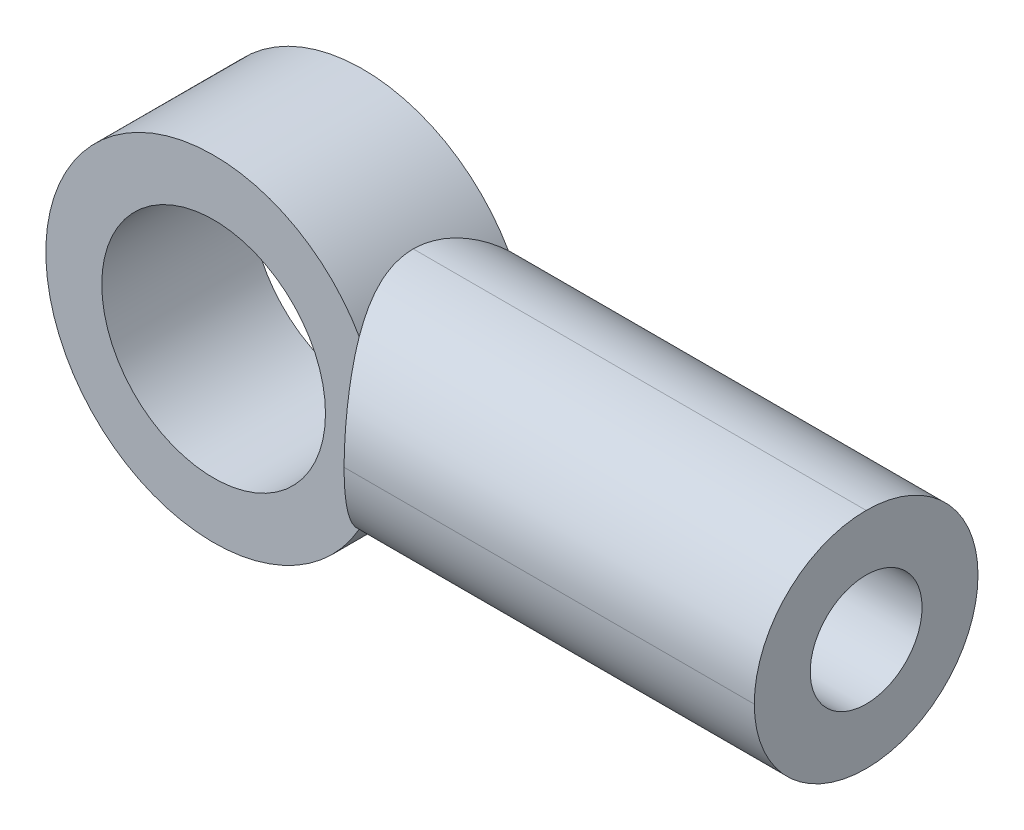
ISO-10303-21;
HEADER;
FILE_DESCRIPTION(('STEP AP214'),'2;1');
FILE_NAME('part.step','',(''),(''),'','','');
FILE_SCHEMA(('AUTOMOTIVE_DESIGN { 1 0 10303 214 1 1 1 1 }'));
ENDSEC;
DATA;
#1=APPLICATION_CONTEXT('core data for automotive mechanical design processes');
#2=APPLICATION_PROTOCOL_DEFINITION('international standard','automotive_design',2000,#1);
#3=PRODUCT_CONTEXT('',#1,'mechanical');
#4=PRODUCT('Part','Part','',(#3));
#5=PRODUCT_RELATED_PRODUCT_CATEGORY('part','',(#4));
#6=PRODUCT_DEFINITION_FORMATION('','',#4);
#7=PRODUCT_DEFINITION_CONTEXT('part definition',#1,'design');
#8=PRODUCT_DEFINITION('design','',#6,#7);
#9=PRODUCT_DEFINITION_SHAPE('','',#8);
#10=(LENGTH_UNIT() NAMED_UNIT(*) SI_UNIT(.MILLI.,.METRE.));
#11=(NAMED_UNIT(*) PLANE_ANGLE_UNIT() SI_UNIT($,.RADIAN.));
#12=(NAMED_UNIT(*) SI_UNIT($,.STERADIAN.) SOLID_ANGLE_UNIT());
#13=UNCERTAINTY_MEASURE_WITH_UNIT(LENGTH_MEASURE(1.E-05),#10,'distance_accuracy_value','');
#14=(GEOMETRIC_REPRESENTATION_CONTEXT(3) GLOBAL_UNCERTAINTY_ASSIGNED_CONTEXT((#13)) GLOBAL_UNIT_ASSIGNED_CONTEXT((#10,
#11,#12)) REPRESENTATION_CONTEXT('',''));
#15=CARTESIAN_POINT('',(0.,0.,0.));
#16=DIRECTION('',(0.,0.,1.));
#17=DIRECTION('',(1.,0.,0.));
#18=AXIS2_PLACEMENT_3D('',#15,#16,#17);
#19=CARTESIAN_POINT('',(0.,0.,3.));
#20=DIRECTION('',(0.,0.,-1.));
#21=DIRECTION('',(-1.,0.,0.));
#22=AXIS2_PLACEMENT_3D('',#19,#20,#21);
#23=CYLINDRICAL_SURFACE('',#22,4.5);
#24=CARTESIAN_POINT('',(3.35410196624968,-3.,0.));
#25=CARTESIAN_POINT('',(3.35406134429177,-3.00001922649583,0.0737500729630075));
#26=CARTESIAN_POINT('',(3.3565333263811,-2.99728132847849,0.147474878822638));
#27=CARTESIAN_POINT('',(3.36618995948174,-2.98644589716527,0.294122881992987));
#28=CARTESIAN_POINT('',(3.37336829420329,-2.97835554714265,0.367047020678862));
#29=CARTESIAN_POINT('',(3.39203341996339,-2.95707534928772,0.51082564887276));
#30=CARTESIAN_POINT('',(3.40347668413969,-2.9439369798464,0.581693504350629));
#31=CARTESIAN_POINT('',(3.43016257931678,-2.91280054555006,0.721619797131198));
#32=CARTESIAN_POINT('',(3.44540631506336,-2.89480106750951,0.790677701843711));
#33=CARTESIAN_POINT('',(3.49579219705687,-2.8341116995379,0.993826292014371));
#34=CARTESIAN_POINT('',(3.5357133177395,-2.78459837578925,1.12475489564761));
#35=CARTESIAN_POINT('',(3.62363577254264,-2.66918201900051,1.37650076811295));
#36=CARTESIAN_POINT('',(3.67166009211261,-2.60323210082252,1.49728776726599));
#37=CARTESIAN_POINT('',(3.77920279642146,-2.44501748892159,1.74549101590243));
#38=CARTESIAN_POINT('',(3.83935114384056,-2.35026226206031,1.87105269878833));
#39=CARTESIAN_POINT('',(3.95919561404939,-2.14225023379348,2.10604819572586));
#40=CARTESIAN_POINT('',(4.01889146507348,-2.02898311335466,2.21547294952505));
#41=CARTESIAN_POINT('',(4.14139365529746,-1.76708092389747,2.43107414050749));
#42=CARTESIAN_POINT('',(4.20338729938338,-1.61569746061092,2.53445771988131));
#43=CARTESIAN_POINT('',(4.2859943906525,-1.3738802693201,2.66851230850701));
#44=CARTESIAN_POINT('',(4.31178850797788,-1.29086583935502,2.7096773120417));
#45=CARTESIAN_POINT('',(4.35918703932191,-1.1203958838131,2.78448476521184));
#46=CARTESIAN_POINT('',(4.38079470051315,-1.03294386717625,2.81813304822261));
#47=CARTESIAN_POINT('',(4.41596043448945,-0.868981795511263,2.87246582221212));
#48=CARTESIAN_POINT('',(4.43025761885054,-0.793031936319327,2.89437164890672));
#49=CARTESIAN_POINT('',(4.45507284097399,-0.639065344131672,2.9322137473963));
#50=CARTESIAN_POINT('',(4.46559189616575,-0.561049173667882,2.94815162637604));
#51=CARTESIAN_POINT('',(4.48263156751613,-0.402951343028388,2.97390065684391));
#52=CARTESIAN_POINT('',(4.48912069393415,-0.322858387972111,2.9836635679772));
#53=CARTESIAN_POINT('',(4.49781756203709,-0.161848615283422,2.99672598304132));
#54=CARTESIAN_POINT('',(4.50002158690586,-0.0809311435706957,3.00001987589298));
#55=CARTESIAN_POINT('',(4.5,0.,3.));
#56=B_SPLINE_CURVE_WITH_KNOTS('',3,(#24,#25,#26,#27,#28,#29,#30,#31,#32,#33,#34,#35,#36,#37,#38,
#39,#40,#41,#42,#43,#44,#45,#46,#47,#48,#49,#50,#51,#52,#53,#54,#55),.UNSPECIFIED.,.F.,.F.,(4,2,
2,2,2,2,2,2,2,2,2,2,2,2,2,4),(0.,0.221117290150849,0.441938429564277,0.660565025502978,
0.879255247491347,1.3140236854943,1.75004677971232,2.25337247445359,2.75697969960203,
3.33391454856022,3.62207411220942,3.9100092657634,4.15068140679281,4.39128868745874,
4.63375315982037,4.87642784762445),.UNSPECIFIED.);
#57=CARTESIAN_POINT('',(3.35410196624968,-3.,0.));
#58=VERTEX_POINT('',#57);
#59=CARTESIAN_POINT('',(3.90512483795333,-2.23606797749979,2.));
#60=VERTEX_POINT('',#59);
#61=EDGE_CURVE('E100',#58,#60,#56,.T.);
#62=ORIENTED_EDGE('',*,*,#61,.T.);
#63=CARTESIAN_POINT('',(0.,0.,2.));
#64=DIRECTION('',(0.,0.,1.));
#65=DIRECTION('',(1.,0.,0.));
#66=AXIS2_PLACEMENT_3D('',#63,#64,#65);
#67=CIRCLE('',#66,4.5);
#68=CARTESIAN_POINT('',(3.90512483795333,2.23606797749979,2.));
#69=VERTEX_POINT('',#68);
#70=EDGE_CURVE('E50',#69,#60,#67,.T.);
#71=ORIENTED_EDGE('',*,*,#70,.F.);
#72=CARTESIAN_POINT('',(4.5,0.,3.));
#73=CARTESIAN_POINT('',(4.50001617829843,0.0756475839526088,3.00001479337604));
#74=CARTESIAN_POINT('',(4.49809296179134,0.15128401615669,2.99713920958104));
#75=CARTESIAN_POINT('',(4.49049022821725,0.301896170959764,2.98572195766942));
#76=CARTESIAN_POINT('',(4.48481284482209,0.376872244359036,2.97718350802096));
#77=CARTESIAN_POINT('',(4.46986964389088,0.525159703140233,2.95462384888522));
#78=CARTESIAN_POINT('',(4.46062588677823,0.598478444991007,2.94063634042276));
#79=CARTESIAN_POINT('',(4.43877875645743,0.743384811046702,2.90738922412249));
#80=CARTESIAN_POINT('',(4.42617506145128,0.814972268721229,2.88812911129631));
#81=CARTESIAN_POINT('',(4.38378192752443,1.02614451296516,2.82288077442639));
#82=CARTESIAN_POINT('',(4.34936538300913,1.16256292939198,2.76935834052541));
#83=CARTESIAN_POINT('',(4.27094017557267,1.42400473597409,2.64448206211332));
#84=CARTESIAN_POINT('',(4.22691920643969,1.54901321232293,2.5731053234158));
#85=CARTESIAN_POINT('',(4.12840642155255,1.79593011791963,2.40800877182395));
#86=CARTESIAN_POINT('',(4.07334466925175,1.91668821691472,2.31291240952251));
#87=CARTESIAN_POINT('',(3.95972492705014,2.14161105109933,2.10638698624117));
#88=CARTESIAN_POINT('',(3.90116254660953,2.24575432087847,1.99493714850863));
#89=CARTESIAN_POINT('',(3.77593429371759,2.45131731165124,1.73843958633942));
#90=CARTESIAN_POINT('',(3.70944663388175,2.54971849148677,1.59086511289124));
#91=CARTESIAN_POINT('',(3.58627882725789,2.72023311787638,1.27751600863165));
#92=CARTESIAN_POINT('',(3.52958469468627,2.79238421697602,1.11176789367188));
#93=CARTESIAN_POINT('',(3.44937197620885,2.89044625252346,0.813888743130085));
#94=CARTESIAN_POINT('',(3.42100530248184,2.92366456859799,0.685517816812848));
#95=CARTESIAN_POINT('',(3.38895349570405,2.96061579891419,0.489078166455413));
#96=CARTESIAN_POINT('',(3.38002314600923,2.9707828945105,0.423022405469136));
#97=CARTESIAN_POINT('',(3.3659677668099,2.98670034948591,0.289994712459127));
#98=CARTESIAN_POINT('',(3.36084030684112,2.99245352992276,0.223023393502944));
#99=CARTESIAN_POINT('',(3.35651675795855,2.99729829619032,0.129921847014653));
#100=CARTESIAN_POINT('',(3.35561173290739,2.99831129239719,0.103951023260638));
#101=CARTESIAN_POINT('',(3.35440443622911,2.99966195084455,0.0519879839956209));
#102=CARTESIAN_POINT('',(3.35410192949018,2.99999987650801,0.0259957807897194));
#103=CARTESIAN_POINT('',(3.35410196625091,3.00000000000001,0.));
#104=B_SPLINE_CURVE_WITH_KNOTS('',3,(#72,#73,#74,#75,#76,#77,#78,#79,#80,#81,#82,#83,#84,#85,
#86,#87,#88,#89,#90,#91,#92,#93,#94,#95,#96,#97,#98,#99,#100,#101,#102,#103),.UNSPECIFIED.,.F.,
.F.,(4,2,2,2,2,2,2,2,2,2,2,2,2,2,2,4),(0.,0.226845375414056,0.453561934483315,0.678898019294547,
0.904255693424228,1.35369386011239,1.80371131263528,2.29167686469777,2.78026782257844,
3.34589677629489,3.91071117528374,4.31569115064711,4.51775757505383,4.71969474527131,
4.79770147059075,4.87567775052966),.UNSPECIFIED.);
#105=CARTESIAN_POINT('',(3.35410196624968,3.,0.));
#106=VERTEX_POINT('',#105);
#107=EDGE_CURVE('E43',#69,#106,#104,.T.);
#108=ORIENTED_EDGE('',*,*,#107,.T.);
#109=CARTESIAN_POINT('',(3.35410196624968,3.,0.));
#110=CARTESIAN_POINT('',(3.35406134429177,3.00001922649583,-0.0737500729630075));
#111=CARTESIAN_POINT('',(3.3565333263811,2.99728132847849,-0.147474878822638));
#112=CARTESIAN_POINT('',(3.36618995948174,2.98644589716527,-0.294122881992987));
#113=CARTESIAN_POINT('',(3.37336829420329,2.97835554714265,-0.367047020678862));
#114=CARTESIAN_POINT('',(3.39203341996339,2.95707534928772,-0.51082564887276));
#115=CARTESIAN_POINT('',(3.40347668413969,2.9439369798464,-0.581693504350629));
#116=CARTESIAN_POINT('',(3.43016257931678,2.91280054555006,-0.721619797131198));
#117=CARTESIAN_POINT('',(3.44540631506336,2.89480106750951,-0.790677701843711));
#118=CARTESIAN_POINT('',(3.49579219705687,2.8341116995379,-0.993826292014371));
#119=CARTESIAN_POINT('',(3.5357133177395,2.78459837578925,-1.12475489564761));
#120=CARTESIAN_POINT('',(3.62363577254264,2.66918201900051,-1.37650076811295));
#121=CARTESIAN_POINT('',(3.67166009211261,2.60323210082252,-1.49728776726599));
#122=CARTESIAN_POINT('',(3.77920279642146,2.44501748892159,-1.74549101590243));
#123=CARTESIAN_POINT('',(3.83935114384056,2.35026226206031,-1.87105269878833));
#124=CARTESIAN_POINT('',(3.95919561404939,2.14225023379348,-2.10604819572586));
#125=CARTESIAN_POINT('',(4.01889146507348,2.02898311335466,-2.21547294952505));
#126=CARTESIAN_POINT('',(4.14139365529746,1.76708092389747,-2.43107414050749));
#127=CARTESIAN_POINT('',(4.20338729938338,1.61569746061092,-2.53445771988131));
#128=CARTESIAN_POINT('',(4.2859943906525,1.3738802693201,-2.66851230850701));
#129=CARTESIAN_POINT('',(4.31178850797788,1.29086583935502,-2.7096773120417));
#130=CARTESIAN_POINT('',(4.35918703932191,1.1203958838131,-2.78448476521184));
#131=CARTESIAN_POINT('',(4.38079470051315,1.03294386717625,-2.81813304822261));
#132=CARTESIAN_POINT('',(4.41596043448945,0.868981795511263,-2.87246582221212));
#133=CARTESIAN_POINT('',(4.43025761885054,0.793031936319327,-2.89437164890672));
#134=CARTESIAN_POINT('',(4.45507284097399,0.639065344131672,-2.9322137473963));
#135=CARTESIAN_POINT('',(4.46559189616575,0.561049173667882,-2.94815162637604));
#136=CARTESIAN_POINT('',(4.48263156751613,0.402951343028388,-2.97390065684391));
#137=CARTESIAN_POINT('',(4.48912069393415,0.322858387972111,-2.9836635679772));
#138=CARTESIAN_POINT('',(4.49781756203709,0.161848615283422,-2.99672598304132));
#139=CARTESIAN_POINT('',(4.50002158690586,0.0809311435706957,-3.00001987589298));
#140=CARTESIAN_POINT('',(4.5,0.,-3.));
#141=B_SPLINE_CURVE_WITH_KNOTS('',3,(#109,#110,#111,#112,#113,#114,#115,#116,#117,#118,#119,
#120,#121,#122,#123,#124,#125,#126,#127,#128,#129,#130,#131,#132,#133,#134,#135,#136,#137,#138,
#139,#140),.UNSPECIFIED.,.F.,.F.,(4,2,2,2,2,2,2,2,2,2,2,2,2,2,2,4),(0.,0.221117290150849,
0.441938429564277,0.660565025502978,0.879255247491347,1.3140236854943,1.75004677971232,
2.25337247445359,2.75697969960203,3.33391454856022,3.62207411220942,3.9100092657634,
4.15068140679281,4.39128868745874,4.63375315982037,4.87642784762445),.UNSPECIFIED.);
#142=CARTESIAN_POINT('',(3.90512483795333,2.23606797749979,-2.));
#143=VERTEX_POINT('',#142);
#144=EDGE_CURVE('E107',#106,#143,#141,.T.);
#145=ORIENTED_EDGE('',*,*,#144,.T.);
#146=CARTESIAN_POINT('',(0.,0.,-2.));
#147=DIRECTION('',(0.,0.,1.));
#148=DIRECTION('',(1.,0.,0.));
#149=AXIS2_PLACEMENT_3D('',#146,#147,#148);
#150=CIRCLE('',#149,4.5);
#151=CARTESIAN_POINT('',(3.90512483795333,-2.23606797749979,-2.));
#152=VERTEX_POINT('',#151);
#153=EDGE_CURVE('E206',#143,#152,#150,.T.);
#154=ORIENTED_EDGE('',*,*,#153,.T.);
#155=CARTESIAN_POINT('',(4.5,0.,-3.));
#156=CARTESIAN_POINT('',(4.50001617829843,-0.0756475839526088,-3.00001479337604));
#157=CARTESIAN_POINT('',(4.49809296179134,-0.15128401615669,-2.99713920958104));
#158=CARTESIAN_POINT('',(4.49049022821725,-0.301896170959764,-2.98572195766942));
#159=CARTESIAN_POINT('',(4.48481284482209,-0.376872244359036,-2.97718350802096));
#160=CARTESIAN_POINT('',(4.46986964389088,-0.525159703140233,-2.95462384888522));
#161=CARTESIAN_POINT('',(4.46062588677823,-0.598478444991007,-2.94063634042276));
#162=CARTESIAN_POINT('',(4.43877875645743,-0.743384811046702,-2.90738922412249));
#163=CARTESIAN_POINT('',(4.42617506145128,-0.814972268721229,-2.88812911129631));
#164=CARTESIAN_POINT('',(4.38378192752443,-1.02614451296516,-2.82288077442639));
#165=CARTESIAN_POINT('',(4.34936538300913,-1.16256292939198,-2.76935834052541));
#166=CARTESIAN_POINT('',(4.27094017557267,-1.42400473597409,-2.64448206211332));
#167=CARTESIAN_POINT('',(4.22691920643969,-1.54901321232293,-2.5731053234158));
#168=CARTESIAN_POINT('',(4.12840642155255,-1.79593011791963,-2.40800877182395));
#169=CARTESIAN_POINT('',(4.07334466925175,-1.91668821691472,-2.31291240952251));
#170=CARTESIAN_POINT('',(3.95972492705014,-2.14161105109933,-2.10638698624117));
#171=CARTESIAN_POINT('',(3.90116254660953,-2.24575432087847,-1.99493714850863));
#172=CARTESIAN_POINT('',(3.77593429371759,-2.45131731165124,-1.73843958633942));
#173=CARTESIAN_POINT('',(3.70944663388175,-2.54971849148677,-1.59086511289124));
#174=CARTESIAN_POINT('',(3.58627882725789,-2.72023311787638,-1.27751600863165));
#175=CARTESIAN_POINT('',(3.52958469468627,-2.79238421697602,-1.11176789367188));
#176=CARTESIAN_POINT('',(3.44937197620885,-2.89044625252346,-0.813888743130085));
#177=CARTESIAN_POINT('',(3.42100530248184,-2.92366456859799,-0.685517816812848));
#178=CARTESIAN_POINT('',(3.38895349570405,-2.96061579891419,-0.489078166455413));
#179=CARTESIAN_POINT('',(3.38002314600923,-2.9707828945105,-0.423022405469136));
#180=CARTESIAN_POINT('',(3.3659677668099,-2.98670034948591,-0.289994712459127));
#181=CARTESIAN_POINT('',(3.36084030684112,-2.99245352992276,-0.223023393502944));
#182=CARTESIAN_POINT('',(3.35651675795855,-2.99729829619032,-0.129921847014653));
#183=CARTESIAN_POINT('',(3.35561173290739,-2.99831129239719,-0.103951023260638));
#184=CARTESIAN_POINT('',(3.35440443622911,-2.99966195084455,-0.0519879839956209));
#185=CARTESIAN_POINT('',(3.35410192949018,-2.99999987650801,-0.0259957807897194));
#186=CARTESIAN_POINT('',(3.35410196625091,-3.00000000000001,0.));
#187=B_SPLINE_CURVE_WITH_KNOTS('',3,(#155,#156,#157,#158,#159,#160,#161,#162,#163,#164,#165,
#166,#167,#168,#169,#170,#171,#172,#173,#174,#175,#176,#177,#178,#179,#180,#181,#182,#183,#184,
#185,#186),.UNSPECIFIED.,.F.,.F.,(4,2,2,2,2,2,2,2,2,2,2,2,2,2,2,4),(0.,0.226845375414056,
0.453561934483315,0.678898019294547,0.904255693424228,1.35369386011239,1.80371131263528,
2.29167686469777,2.78026782257844,3.34589677629489,3.91071117528374,4.31569115064711,
4.51775757505383,4.71969474527131,4.79770147059075,4.87567775052966),.UNSPECIFIED.);
#188=EDGE_CURVE('E137',#152,#58,#187,.T.);
#189=ORIENTED_EDGE('',*,*,#188,.T.);
#190=EDGE_LOOP('',(#62,#71,#108,#145,#154,#189));
#191=FACE_BOUND('',#190,.T.);
#192=ADVANCED_FACE('F33',(#191),#23,.T.);
#193=CARTESIAN_POINT('',(15.5,-3.,3.));
#194=DIRECTION('',(-1.,0.,0.));
#195=DIRECTION('',(0.,0.,1.));
#196=AXIS2_PLACEMENT_3D('',#193,#194,#195);
#197=PLANE('',#196);
#198=CARTESIAN_POINT('',(15.5,0.,0.));
#199=DIRECTION('',(1.,0.,0.));
#200=DIRECTION('',(0.,0.,-1.));
#201=AXIS2_PLACEMENT_3D('',#198,#199,#200);
#202=CIRCLE('',#201,1.5);
#203=CARTESIAN_POINT('',(15.5,0.,-1.5));
#204=VERTEX_POINT('',#203);
#205=EDGE_CURVE('E154',#204,#204,#202,.T.);
#206=ORIENTED_EDGE('',*,*,#205,.F.);
#207=EDGE_LOOP('',(#206));
#208=FACE_BOUND('',#207,.T.);
#209=CARTESIAN_POINT('',(15.5,0.,0.));
#210=DIRECTION('',(-1.,0.,0.));
#211=DIRECTION('',(0.,0.,1.));
#212=AXIS2_PLACEMENT_3D('',#209,#210,#211);
#213=CIRCLE('',#212,3.);
#214=CARTESIAN_POINT('',(15.5,3.,0.));
#215=VERTEX_POINT('',#214);
#216=CARTESIAN_POINT('',(15.5,0.,3.));
#217=VERTEX_POINT('',#216);
#218=EDGE_CURVE('E149',#215,#217,#213,.F.);
#219=ORIENTED_EDGE('',*,*,#218,.T.);
#220=CARTESIAN_POINT('',(15.5,0.,0.));
#221=DIRECTION('',(-1.,0.,0.));
#222=DIRECTION('',(0.,0.,1.));
#223=AXIS2_PLACEMENT_3D('',#220,#221,#222);
#224=CIRCLE('',#223,3.);
#225=CARTESIAN_POINT('',(15.5,-3.,0.));
#226=VERTEX_POINT('',#225);
#227=EDGE_CURVE('E142',#217,#226,#224,.F.);
#228=ORIENTED_EDGE('',*,*,#227,.T.);
#229=CARTESIAN_POINT('',(15.5,0.,0.));
#230=DIRECTION('',(-1.,0.,0.));
#231=DIRECTION('',(0.,0.,1.));
#232=AXIS2_PLACEMENT_3D('',#229,#230,#231);
#233=CIRCLE('',#232,3.);
#234=CARTESIAN_POINT('',(15.5,0.,-3.));
#235=VERTEX_POINT('',#234);
#236=EDGE_CURVE('E145',#226,#235,#233,.F.);
#237=ORIENTED_EDGE('',*,*,#236,.T.);
#238=CARTESIAN_POINT('',(15.5,0.,0.));
#239=DIRECTION('',(-1.,0.,0.));
#240=DIRECTION('',(0.,0.,1.));
#241=AXIS2_PLACEMENT_3D('',#238,#239,#240);
#242=CIRCLE('',#241,3.);
#243=EDGE_CURVE('E147',#235,#215,#242,.F.);
#244=ORIENTED_EDGE('',*,*,#243,.T.);
#245=EDGE_LOOP('',(#219,#228,#237,#244));
#246=FACE_BOUND('',#245,.T.);
#247=ADVANCED_FACE('F183',(#208,#246),#197,.F.);
#248=CARTESIAN_POINT('',(0.,0.,-3.));
#249=DIRECTION('',(0.,0.,1.));
#250=DIRECTION('',(1.,0.,0.));
#251=AXIS2_PLACEMENT_3D('',#248,#249,#250);
#252=CYLINDRICAL_SURFACE('',#251,3.);
#253=CARTESIAN_POINT('',(0.,0.,2.));
#254=DIRECTION('',(0.,0.,-1.));
#255=DIRECTION('',(-1.,0.,0.));
#256=AXIS2_PLACEMENT_3D('',#253,#254,#255);
#257=CIRCLE('',#256,3.);
#258=CARTESIAN_POINT('',(-3.,0.,2.));
#259=VERTEX_POINT('',#258);
#260=EDGE_CURVE('E101',#259,#259,#257,.F.);
#261=ORIENTED_EDGE('',*,*,#260,.T.);
#262=EDGE_LOOP('',(#261));
#263=FACE_BOUND('',#262,.T.);
#264=CARTESIAN_POINT('',(0.,0.,-2.));
#265=DIRECTION('',(0.,0.,1.));
#266=DIRECTION('',(1.,0.,0.));
#267=AXIS2_PLACEMENT_3D('',#264,#265,#266);
#268=CIRCLE('',#267,3.);
#269=CARTESIAN_POINT('',(3.,0.,-2.));
#270=VERTEX_POINT('',#269);
#271=EDGE_CURVE('E163',#270,#270,#268,.F.);
#272=ORIENTED_EDGE('',*,*,#271,.T.);
#273=EDGE_LOOP('',(#272));
#274=FACE_BOUND('',#273,.T.);
#275=ADVANCED_FACE('F180',(#263,#274),#252,.F.);
#276=CARTESIAN_POINT('',(5.5,0.,0.));
#277=DIRECTION('',(-1.,0.,0.));
#278=DIRECTION('',(0.,0.,1.));
#279=AXIS2_PLACEMENT_3D('',#276,#277,#278);
#280=PLANE('',#279);
#281=CARTESIAN_POINT('',(5.5,0.,0.));
#282=DIRECTION('',(-1.,0.,0.));
#283=DIRECTION('',(0.,0.,1.));
#284=AXIS2_PLACEMENT_3D('',#281,#282,#283);
#285=CIRCLE('',#284,1.5);
#286=CARTESIAN_POINT('',(5.5,0.,1.5));
#287=VERTEX_POINT('',#286);
#288=EDGE_CURVE('E151',#287,#287,#285,.F.);
#289=ORIENTED_EDGE('',*,*,#288,.T.);
#290=EDGE_LOOP('',(#289));
#291=FACE_BOUND('',#290,.T.);
#292=ADVANCED_FACE('F176',(#291),#280,.F.);
#293=CARTESIAN_POINT('',(-8.74264068711928,0.,0.));
#294=DIRECTION('',(1.,0.,0.));
#295=DIRECTION('',(0.,0.,-1.));
#296=AXIS2_PLACEMENT_3D('',#293,#294,#295);
#297=CYLINDRICAL_SURFACE('',#296,1.5);
#298=ORIENTED_EDGE('',*,*,#205,.T.);
#299=EDGE_LOOP('',(#298));
#300=FACE_BOUND('',#299,.T.);
#301=ORIENTED_EDGE('',*,*,#288,.F.);
#302=EDGE_LOOP('',(#301));
#303=FACE_BOUND('',#302,.T.);
#304=ADVANCED_FACE('F173',(#300,#303),#297,.F.);
#305=CARTESIAN_POINT('',(3.35410196624968,0.,0.));
#306=DIRECTION('',(-1.,0.,0.));
#307=DIRECTION('',(0.,0.,1.));
#308=AXIS2_PLACEMENT_3D('',#305,#306,#307);
#309=CYLINDRICAL_SURFACE('',#308,3.);
#310=DIRECTION('',(-1.,0.,0.));
#311=VECTOR('',#310,1.);
#312=CARTESIAN_POINT('',(3.35410196624968,3.,0.));
#313=LINE('',#312,#311);
#314=EDGE_CURVE('E106',#215,#106,#313,.T.);
#315=ORIENTED_EDGE('',*,*,#314,.F.);
#316=ORIENTED_EDGE('',*,*,#243,.F.);
#317=DIRECTION('',(-1.,0.,0.));
#318=VECTOR('',#317,1.);
#319=CARTESIAN_POINT('',(0.,0.,-3.));
#320=LINE('',#319,#318);
#321=CARTESIAN_POINT('',(4.5,0.,-3.));
#322=VERTEX_POINT('',#321);
#323=EDGE_CURVE('E38',#322,#235,#320,.F.);
#324=ORIENTED_EDGE('',*,*,#323,.F.);
#325=CARTESIAN_POINT('',(3.90512483795333,2.23606797749979,-2.));
#326=CARTESIAN_POINT('',(3.93648565785325,2.18131087785969,-2.06121158447974));
#327=CARTESIAN_POINT('',(3.96775597868251,2.12401685264989,-2.12021733591239));
#328=CARTESIAN_POINT('',(4.02945830903792,2.00448936871068,-2.23356681109082));
#329=CARTESIAN_POINT('',(4.05988972989496,1.94225255471545,-2.28790731498989));
#330=CARTESIAN_POINT('',(4.11947871478228,1.81246878223212,-2.39205723249963));
#331=CARTESIAN_POINT('',(4.14862237230251,1.74487912688567,-2.44182153472596));
#332=CARTESIAN_POINT('',(4.204667592158,1.6051278538223,-2.53587403950595));
#333=CARTESIAN_POINT('',(4.2315696227687,1.53296719655888,-2.58016338671616));
#334=CARTESIAN_POINT('',(4.28263164018991,1.38394504735761,-2.66308209422524));
#335=CARTESIAN_POINT('',(4.30677531420076,1.30705934841432,-2.70167813969374));
#336=CARTESIAN_POINT('',(4.3515066518601,1.14939203463769,-2.77242878322866));
#337=CARTESIAN_POINT('',(4.37209495126297,1.06861111963912,-2.80458453308133));
#338=CARTESIAN_POINT('',(4.40903447346399,0.904144885686451,-2.8618282635754));
#339=CARTESIAN_POINT('',(4.42540787435172,0.820477510410398,-2.8869533021526));
#340=CARTESIAN_POINT('',(4.45355505363067,0.650582422392596,-2.92991722053039));
#341=CARTESIAN_POINT('',(4.46533177988428,0.564356388835485,-2.94776077030855));
#342=CARTESIAN_POINT('',(4.48299178751084,0.398754581235036,-2.97444276847066));
#343=CARTESIAN_POINT('',(4.48934230187529,0.319543458887048,-2.98399661683265));
#344=CARTESIAN_POINT('',(4.49786077904754,0.160228371114745,-2.99679088487063));
#345=CARTESIAN_POINT('',(4.50002016626042,0.0801229116679854,-3.00001836009247));
#346=CARTESIAN_POINT('',(4.5,0.,-3.));
#347=B_SPLINE_CURVE_WITH_KNOTS('',3,(#325,#326,#327,#328,#329,#330,#331,#332,#333,#334,#335,
#336,#337,#338,#339,#340,#341,#342,#343,#344,#345,#346),.UNSPECIFIED.,.F.,.F.,(4,2,2,2,2,2,2,2,
2,2,4),(0.,0.263693442825438,0.527567441756176,0.793812953046294,1.0600027055296,
1.32769306282831,1.5953355033935,1.86153945837058,2.12757241428592,2.36732739736734,
2.6075724355035),.UNSPECIFIED.);
#348=EDGE_CURVE('E157',#143,#322,#347,.T.);
#349=ORIENTED_EDGE('',*,*,#348,.F.);
#350=ORIENTED_EDGE('',*,*,#144,.F.);
#351=EDGE_LOOP('',(#315,#316,#324,#349,#350));
#352=FACE_BOUND('',#351,.T.);
#353=ADVANCED_FACE('F35',(#352),#309,.T.);
#354=CARTESIAN_POINT('',(3.35410196624968,0.,0.));
#355=DIRECTION('',(1.,0.,0.));
#356=DIRECTION('',(0.,0.,-1.));
#357=AXIS2_PLACEMENT_3D('',#354,#355,#356);
#358=CYLINDRICAL_SURFACE('',#357,3.);
#359=ORIENTED_EDGE('',*,*,#323,.T.);
#360=ORIENTED_EDGE('',*,*,#236,.F.);
#361=DIRECTION('',(1.,0.,0.));
#362=VECTOR('',#361,1.);
#363=CARTESIAN_POINT('',(3.35410196624968,-3.,0.));
#364=LINE('',#363,#362);
#365=EDGE_CURVE('E195',#58,#226,#364,.T.);
#366=ORIENTED_EDGE('',*,*,#365,.F.);
#367=ORIENTED_EDGE('',*,*,#188,.F.);
#368=EDGE_CURVE('E108',#322,#152,#187,.T.);
#369=ORIENTED_EDGE('',*,*,#368,.F.);
#370=EDGE_LOOP('',(#359,#360,#366,#367,#369));
#371=FACE_BOUND('',#370,.T.);
#372=ADVANCED_FACE('F128',(#371),#358,.T.);
#373=CARTESIAN_POINT('',(0.,0.,0.));
#374=DIRECTION('',(1.,0.,0.));
#375=DIRECTION('',(0.,0.,-1.));
#376=AXIS2_PLACEMENT_3D('',#373,#374,#375);
#377=CYLINDRICAL_SURFACE('',#376,3.);
#378=ORIENTED_EDGE('',*,*,#314,.T.);
#379=ORIENTED_EDGE('',*,*,#107,.F.);
#380=CARTESIAN_POINT('',(4.5,0.,3.));
#381=VERTEX_POINT('',#380);
#382=EDGE_CURVE('E12',#381,#69,#104,.T.);
#383=ORIENTED_EDGE('',*,*,#382,.F.);
#384=DIRECTION('',(-1.,0.,0.));
#385=VECTOR('',#384,1.);
#386=CARTESIAN_POINT('',(3.35410196624968,0.,3.));
#387=LINE('',#386,#385);
#388=EDGE_CURVE('E120',#217,#381,#387,.T.);
#389=ORIENTED_EDGE('',*,*,#388,.F.);
#390=ORIENTED_EDGE('',*,*,#218,.F.);
#391=EDGE_LOOP('',(#378,#379,#383,#389,#390));
#392=FACE_BOUND('',#391,.T.);
#393=ADVANCED_FACE('F103',(#392),#377,.T.);
#394=CARTESIAN_POINT('',(0.,0.,0.));
#395=DIRECTION('',(-1.,0.,0.));
#396=DIRECTION('',(0.,0.,1.));
#397=AXIS2_PLACEMENT_3D('',#394,#395,#396);
#398=CYLINDRICAL_SURFACE('',#397,3.);
#399=ORIENTED_EDGE('',*,*,#61,.F.);
#400=ORIENTED_EDGE('',*,*,#365,.T.);
#401=ORIENTED_EDGE('',*,*,#227,.F.);
#402=ORIENTED_EDGE('',*,*,#388,.T.);
#403=EDGE_CURVE('E91',#60,#381,#56,.T.);
#404=ORIENTED_EDGE('',*,*,#403,.F.);
#405=EDGE_LOOP('',(#399,#400,#401,#402,#404));
#406=FACE_BOUND('',#405,.T.);
#407=ADVANCED_FACE('F127',(#406),#398,.T.);
#408=CARTESIAN_POINT('',(0.,0.,-2.));
#409=DIRECTION('',(0.,0.,1.));
#410=DIRECTION('',(1.,0.,0.));
#411=AXIS2_PLACEMENT_3D('',#408,#409,#410);
#412=PLANE('',#411);
#413=ORIENTED_EDGE('',*,*,#153,.F.);
#414=EDGE_CURVE('E209',#152,#143,#150,.T.);
#415=ORIENTED_EDGE('',*,*,#414,.F.);
#416=EDGE_LOOP('',(#413,#415));
#417=FACE_BOUND('',#416,.T.);
#418=ORIENTED_EDGE('',*,*,#271,.F.);
#419=EDGE_LOOP('',(#418));
#420=FACE_BOUND('',#419,.T.);
#421=ADVANCED_FACE('F170',(#417,#420),#412,.F.);
#422=CARTESIAN_POINT('',(0.,0.,-12.));
#423=DIRECTION('',(0.,0.,1.));
#424=DIRECTION('',(1.,0.,0.));
#425=AXIS2_PLACEMENT_3D('',#422,#423,#424);
#426=CYLINDRICAL_SURFACE('',#425,4.5);
#427=ORIENTED_EDGE('',*,*,#348,.T.);
#428=ORIENTED_EDGE('',*,*,#368,.T.);
#429=ORIENTED_EDGE('',*,*,#414,.T.);
#430=EDGE_LOOP('',(#427,#428,#429));
#431=FACE_BOUND('',#430,.T.);
#432=ADVANCED_FACE('F165',(#431),#426,.F.);
#433=CARTESIAN_POINT('',(0.,0.,2.));
#434=DIRECTION('',(0.,0.,-1.));
#435=DIRECTION('',(1.,0.,0.));
#436=AXIS2_PLACEMENT_3D('',#433,#434,#435);
#437=PLANE('',#436);
#438=ORIENTED_EDGE('',*,*,#70,.T.);
#439=EDGE_CURVE('E89',#60,#69,#67,.T.);
#440=ORIENTED_EDGE('',*,*,#439,.T.);
#441=EDGE_LOOP('',(#438,#440));
#442=FACE_BOUND('',#441,.T.);
#443=ORIENTED_EDGE('',*,*,#260,.F.);
#444=EDGE_LOOP('',(#443));
#445=FACE_BOUND('',#444,.T.);
#446=ADVANCED_FACE('F95',(#442,#445),#437,.F.);
#447=CARTESIAN_POINT('',(0.,0.,12.));
#448=DIRECTION('',(0.,0.,-1.));
#449=DIRECTION('',(-1.,0.,0.));
#450=AXIS2_PLACEMENT_3D('',#447,#448,#449);
#451=CYLINDRICAL_SURFACE('',#450,4.5);
#452=ORIENTED_EDGE('',*,*,#439,.F.);
#453=ORIENTED_EDGE('',*,*,#403,.T.);
#454=ORIENTED_EDGE('',*,*,#382,.T.);
#455=EDGE_LOOP('',(#452,#453,#454));
#456=FACE_BOUND('',#455,.T.);
#457=ADVANCED_FACE('F88',(#456),#451,.F.);
#458=CLOSED_SHELL('',(#192,#247,#275,#292,#304,#353,#372,#393,#407,#421,#432,#446,#457));
#459=MANIFOLD_SOLID_BREP('B2',#458);
#460=ADVANCED_BREP_SHAPE_REPRESENTATION('',(#18,#459),#14);
#461=SHAPE_DEFINITION_REPRESENTATION(#9,#460);
ENDSEC;
END-ISO-10303-21;
